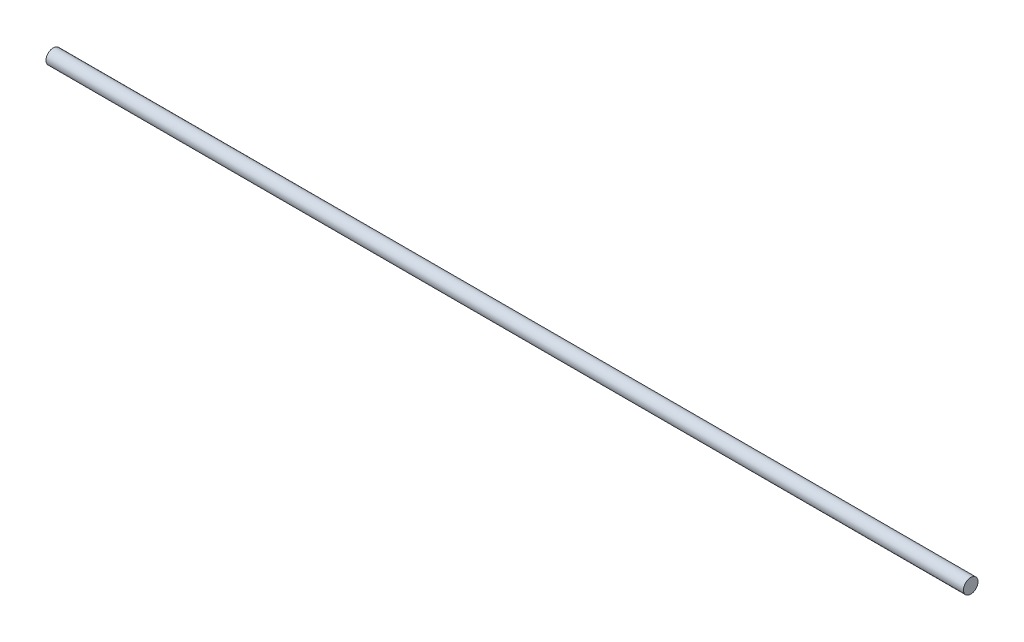
ISO-10303-21;
HEADER;
FILE_DESCRIPTION(('STEP AP214'),'2;1');
FILE_NAME('part.step','',(''),(''),'','','');
FILE_SCHEMA(('AUTOMOTIVE_DESIGN { 1 0 10303 214 1 1 1 1 }'));
ENDSEC;
DATA;
#1=APPLICATION_CONTEXT('core data for automotive mechanical design processes');
#2=APPLICATION_PROTOCOL_DEFINITION('international standard','automotive_design',2000,#1);
#3=PRODUCT_CONTEXT('',#1,'mechanical');
#4=PRODUCT('Part','Part','',(#3));
#5=PRODUCT_RELATED_PRODUCT_CATEGORY('part','',(#4));
#6=PRODUCT_DEFINITION_FORMATION('','',#4);
#7=PRODUCT_DEFINITION_CONTEXT('part definition',#1,'design');
#8=PRODUCT_DEFINITION('design','',#6,#7);
#9=PRODUCT_DEFINITION_SHAPE('','',#8);
#10=(LENGTH_UNIT() NAMED_UNIT(*) SI_UNIT(.MILLI.,.METRE.));
#11=(NAMED_UNIT(*) PLANE_ANGLE_UNIT() SI_UNIT($,.RADIAN.));
#12=(NAMED_UNIT(*) SI_UNIT($,.STERADIAN.) SOLID_ANGLE_UNIT());
#13=UNCERTAINTY_MEASURE_WITH_UNIT(LENGTH_MEASURE(1.E-05),#10,'distance_accuracy_value','');
#14=(GEOMETRIC_REPRESENTATION_CONTEXT(3) GLOBAL_UNCERTAINTY_ASSIGNED_CONTEXT((#13)) GLOBAL_UNIT_ASSIGNED_CONTEXT((#10,
#11,#12)) REPRESENTATION_CONTEXT('',''));
#15=CARTESIAN_POINT('',(0.,0.,0.));
#16=DIRECTION('',(0.,0.,1.));
#17=DIRECTION('',(1.,0.,0.));
#18=AXIS2_PLACEMENT_3D('',#15,#16,#17);
#19=CARTESIAN_POINT('',(400.05,0.,0.));
#20=DIRECTION('',(-1.,0.,0.));
#21=DIRECTION('',(0.,0.,1.));
#22=AXIS2_PLACEMENT_3D('',#19,#20,#21);
#23=CYLINDRICAL_SURFACE('',#22,3.175);
#24=CARTESIAN_POINT('',(400.05,0.,0.));
#25=DIRECTION('',(1.,0.,0.));
#26=DIRECTION('',(0.,0.,-1.));
#27=AXIS2_PLACEMENT_3D('',#24,#25,#26);
#28=CIRCLE('',#27,3.175);
#29=CARTESIAN_POINT('',(400.05,0.,3.175));
#30=VERTEX_POINT('',#29);
#31=EDGE_CURVE('E10',#30,#30,#28,.T.);
#32=CARTESIAN_POINT('',(0.,0.,0.));
#33=DIRECTION('',(1.,0.,0.));
#34=DIRECTION('',(0.,0.,-1.));
#35=AXIS2_PLACEMENT_3D('',#32,#33,#34);
#36=CIRCLE('',#35,3.175);
#37=CARTESIAN_POINT('',(0.,0.,3.175));
#38=VERTEX_POINT('',#37);
#39=EDGE_CURVE('E40',#38,#38,#36,.T.);
#40=CARTESIAN_POINT('',(400.05,0.,3.175));
#41=CARTESIAN_POINT('',(395.8828125,0.,3.175));
#42=CARTESIAN_POINT('',(391.715625,0.,3.175));
#43=CARTESIAN_POINT('',(383.38125,0.,3.175));
#44=CARTESIAN_POINT('',(379.2140625,0.,3.175));
#45=CARTESIAN_POINT('',(370.8796875,0.,3.175));
#46=CARTESIAN_POINT('',(366.7125,0.,3.175));
#47=CARTESIAN_POINT('',(358.378125,0.,3.175));
#48=CARTESIAN_POINT('',(354.2109375,0.,3.175));
#49=CARTESIAN_POINT('',(345.8765625,0.,3.175));
#50=CARTESIAN_POINT('',(341.709375,0.,3.175));
#51=CARTESIAN_POINT('',(333.375,0.,3.175));
#52=CARTESIAN_POINT('',(329.2078125,0.,3.175));
#53=CARTESIAN_POINT('',(320.8734375,0.,3.175));
#54=CARTESIAN_POINT('',(316.70625,0.,3.175));
#55=CARTESIAN_POINT('',(308.371875,0.,3.175));
#56=CARTESIAN_POINT('',(304.2046875,0.,3.175));
#57=CARTESIAN_POINT('',(295.8703125,0.,3.175));
#58=CARTESIAN_POINT('',(291.703125,0.,3.175));
#59=CARTESIAN_POINT('',(283.36875,0.,3.175));
#60=CARTESIAN_POINT('',(279.2015625,0.,3.175));
#61=CARTESIAN_POINT('',(270.8671875,0.,3.175));
#62=CARTESIAN_POINT('',(266.7,0.,3.175));
#63=CARTESIAN_POINT('',(258.365625,0.,3.175));
#64=CARTESIAN_POINT('',(254.1984375,0.,3.175));
#65=CARTESIAN_POINT('',(245.8640625,0.,3.175));
#66=CARTESIAN_POINT('',(241.696875,0.,3.175));
#67=CARTESIAN_POINT('',(233.3625,0.,3.175));
#68=CARTESIAN_POINT('',(229.1953125,0.,3.175));
#69=CARTESIAN_POINT('',(220.8609375,0.,3.175));
#70=CARTESIAN_POINT('',(216.69375,0.,3.175));
#71=CARTESIAN_POINT('',(208.359375,0.,3.175));
#72=CARTESIAN_POINT('',(204.1921875,0.,3.175));
#73=CARTESIAN_POINT('',(195.8578125,0.,3.175));
#74=CARTESIAN_POINT('',(191.690625,0.,3.175));
#75=CARTESIAN_POINT('',(183.35625,0.,3.175));
#76=CARTESIAN_POINT('',(179.1890625,0.,3.175));
#77=CARTESIAN_POINT('',(170.8546875,0.,3.175));
#78=CARTESIAN_POINT('',(166.6875,0.,3.175));
#79=CARTESIAN_POINT('',(158.353125,0.,3.175));
#80=CARTESIAN_POINT('',(154.1859375,0.,3.175));
#81=CARTESIAN_POINT('',(145.8515625,0.,3.175));
#82=CARTESIAN_POINT('',(141.684375,0.,3.175));
#83=CARTESIAN_POINT('',(133.35,0.,3.175));
#84=CARTESIAN_POINT('',(129.1828125,0.,3.175));
#85=CARTESIAN_POINT('',(120.8484375,0.,3.175));
#86=CARTESIAN_POINT('',(116.68125,0.,3.175));
#87=CARTESIAN_POINT('',(108.346875,0.,3.175));
#88=CARTESIAN_POINT('',(104.1796875,0.,3.175));
#89=CARTESIAN_POINT('',(95.8453125,0.,3.175));
#90=CARTESIAN_POINT('',(91.678125,0.,3.175));
#91=CARTESIAN_POINT('',(83.34375,0.,3.175));
#92=CARTESIAN_POINT('',(79.1765625,0.,3.175));
#93=CARTESIAN_POINT('',(70.8421875,0.,3.175));
#94=CARTESIAN_POINT('',(66.675,0.,3.175));
#95=CARTESIAN_POINT('',(58.340625,0.,3.175));
#96=CARTESIAN_POINT('',(54.1734375,0.,3.175));
#97=CARTESIAN_POINT('',(45.8390625,0.,3.175));
#98=CARTESIAN_POINT('',(41.671875,0.,3.175));
#99=CARTESIAN_POINT('',(33.3375,0.,3.175));
#100=CARTESIAN_POINT('',(29.1703125,0.,3.175));
#101=CARTESIAN_POINT('',(20.8359375,0.,3.175));
#102=CARTESIAN_POINT('',(16.66875,0.,3.175));
#103=CARTESIAN_POINT('',(8.334375,0.,3.175));
#104=CARTESIAN_POINT('',(4.1671875,0.,3.175));
#105=CARTESIAN_POINT('',(0.,0.,3.175));
#106=B_SPLINE_CURVE_WITH_KNOTS('',3,(#40,#41,#42,#43,#44,#45,#46,#47,#48,#49,#50,#51,#52,#53,
#54,#55,#56,#57,#58,#59,#60,#61,#62,#63,#64,#65,#66,#67,#68,#69,#70,#71,#72,#73,#74,#75,#76,#77,
#78,#79,#80,#81,#82,#83,#84,#85,#86,#87,#88,#89,#90,#91,#92,#93,#94,#95,#96,#97,#98,#99,#100,
#101,#102,#103,#104,#105),.UNSPECIFIED.,.F.,.F.,(4,2,2,2,2,2,2,2,2,2,2,2,2,2,2,2,2,2,2,2,2,2,2,
2,2,2,2,2,2,2,2,2,4),(0.,12.5015625,25.003125,37.5046875,50.00625,62.5078124999999,
75.0093749999999,87.5109374999999,100.0125,112.5140625,125.015625,137.5171875,150.01875,
162.5203125,175.021875,187.5234375,200.025,212.5265625,225.028125,237.5296875,250.03125,
262.5328125,275.034375,287.5359375,300.0375,312.5390625,325.040625,337.5421875,350.04375,
362.5453125,375.046875,387.5484375,400.05),.UNSPECIFIED.);
#107=EDGE_CURVE('BSEAM37',#30,#38,#106,.T.);
#108=ORIENTED_EDGE('',*,*,#31,.F.);
#109=ORIENTED_EDGE('',*,*,#39,.T.);
#110=ORIENTED_EDGE('',*,*,#107,.T.);
#111=ORIENTED_EDGE('',*,*,#107,.F.);
#112=EDGE_LOOP('',(#108,#110,#109,#111));
#113=FACE_BOUND('',#112,.T.);
#114=ADVANCED_FACE('F37',(#113),#23,.T.);
#115=CARTESIAN_POINT('',(400.05,0.,0.));
#116=DIRECTION('',(1.,0.,0.));
#117=DIRECTION('',(0.,0.,-1.));
#118=AXIS2_PLACEMENT_3D('',#115,#116,#117);
#119=PLANE('',#118);
#120=ORIENTED_EDGE('',*,*,#31,.T.);
#121=EDGE_LOOP('',(#120));
#122=FACE_BOUND('',#121,.T.);
#123=ADVANCED_FACE('F52',(#122),#119,.T.);
#124=CARTESIAN_POINT('',(0.,0.,0.));
#125=DIRECTION('',(1.,0.,0.));
#126=DIRECTION('',(0.,0.,-1.));
#127=AXIS2_PLACEMENT_3D('',#124,#125,#126);
#128=PLANE('',#127);
#129=ORIENTED_EDGE('',*,*,#39,.F.);
#130=EDGE_LOOP('',(#129));
#131=FACE_BOUND('',#130,.T.);
#132=ADVANCED_FACE('F50',(#131),#128,.F.);
#133=CLOSED_SHELL('',(#114,#123,#132));
#134=MANIFOLD_SOLID_BREP('B2',#133);
#135=ADVANCED_BREP_SHAPE_REPRESENTATION('',(#18,#134),#14);
#136=SHAPE_DEFINITION_REPRESENTATION(#9,#135);
ENDSEC;
END-ISO-10303-21;
